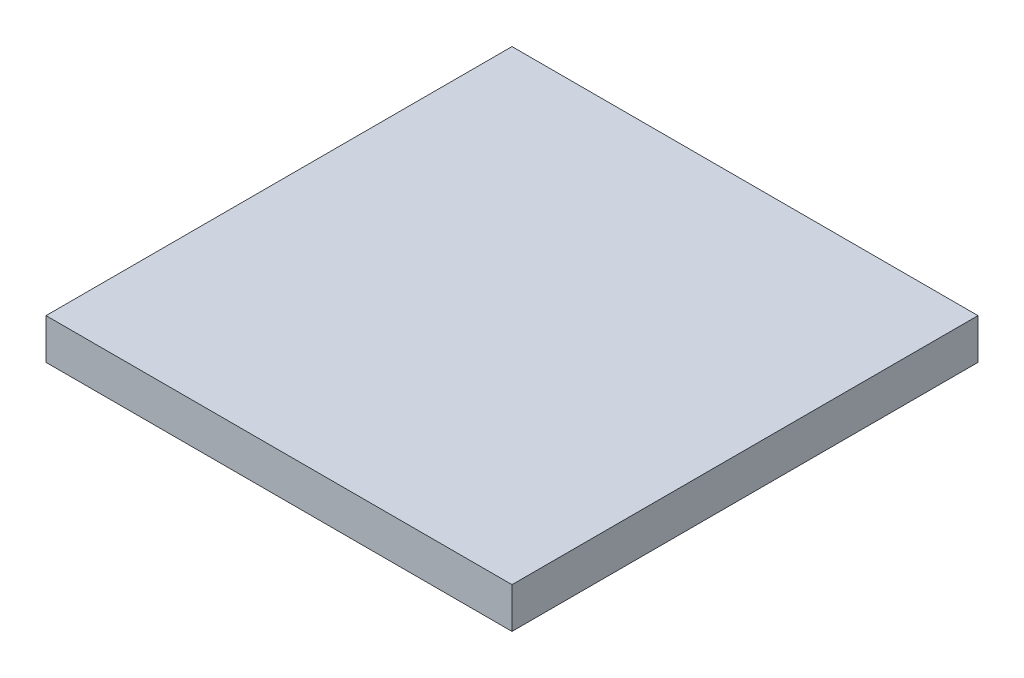
ISO-10303-21;
HEADER;
FILE_DESCRIPTION(('STEP AP214'),'2;1');
FILE_NAME('part.step','',(''),(''),'','','');
FILE_SCHEMA(('AUTOMOTIVE_DESIGN { 1 0 10303 214 1 1 1 1 }'));
ENDSEC;
DATA;
#1=APPLICATION_CONTEXT('core data for automotive mechanical design processes');
#2=APPLICATION_PROTOCOL_DEFINITION('international standard','automotive_design',2000,#1);
#3=PRODUCT_CONTEXT('',#1,'mechanical');
#4=PRODUCT('Part','Part','',(#3));
#5=PRODUCT_RELATED_PRODUCT_CATEGORY('part','',(#4));
#6=PRODUCT_DEFINITION_FORMATION('','',#4);
#7=PRODUCT_DEFINITION_CONTEXT('part definition',#1,'design');
#8=PRODUCT_DEFINITION('design','',#6,#7);
#9=PRODUCT_DEFINITION_SHAPE('','',#8);
#10=(LENGTH_UNIT() NAMED_UNIT(*) SI_UNIT(.MILLI.,.METRE.));
#11=(NAMED_UNIT(*) PLANE_ANGLE_UNIT() SI_UNIT($,.RADIAN.));
#12=(NAMED_UNIT(*) SI_UNIT($,.STERADIAN.) SOLID_ANGLE_UNIT());
#13=UNCERTAINTY_MEASURE_WITH_UNIT(LENGTH_MEASURE(1.E-05),#10,'distance_accuracy_value','');
#14=(GEOMETRIC_REPRESENTATION_CONTEXT(3) GLOBAL_UNCERTAINTY_ASSIGNED_CONTEXT((#13)) GLOBAL_UNIT_ASSIGNED_CONTEXT((#10,
#11,#12)) REPRESENTATION_CONTEXT('',''));
#15=CARTESIAN_POINT('',(0.,0.,0.));
#16=DIRECTION('',(0.,0.,1.));
#17=DIRECTION('',(1.,0.,0.));
#18=AXIS2_PLACEMENT_3D('',#15,#16,#17);
#19=CARTESIAN_POINT('',(57.5,10.,57.5));
#20=DIRECTION('',(-1.,0.,0.));
#21=DIRECTION('',(0.,0.,1.));
#22=AXIS2_PLACEMENT_3D('',#19,#20,#21);
#23=PLANE('',#22);
#24=DIRECTION('',(0.,0.,-1.));
#25=VECTOR('',#24,1.);
#26=CARTESIAN_POINT('',(57.5,0.,57.5));
#27=LINE('',#26,#25);
#28=CARTESIAN_POINT('',(57.5,0.,57.5));
#29=VERTEX_POINT('',#28);
#30=CARTESIAN_POINT('',(57.5,0.,-57.5));
#31=VERTEX_POINT('',#30);
#32=EDGE_CURVE('E107',#29,#31,#27,.T.);
#33=ORIENTED_EDGE('',*,*,#32,.T.);
#34=DIRECTION('',(0.,-1.,0.));
#35=VECTOR('',#34,1.);
#36=CARTESIAN_POINT('',(57.5,10.,-57.5));
#37=LINE('',#36,#35);
#38=CARTESIAN_POINT('',(57.5,10.,-57.5));
#39=VERTEX_POINT('',#38);
#40=EDGE_CURVE('E11',#39,#31,#37,.T.);
#41=ORIENTED_EDGE('',*,*,#40,.F.);
#42=DIRECTION('',(0.,0.,-1.));
#43=VECTOR('',#42,1.);
#44=CARTESIAN_POINT('',(57.5,10.,57.5));
#45=LINE('',#44,#43);
#46=CARTESIAN_POINT('',(57.5,10.,57.5));
#47=VERTEX_POINT('',#46);
#48=EDGE_CURVE('E91',#47,#39,#45,.T.);
#49=ORIENTED_EDGE('',*,*,#48,.F.);
#50=DIRECTION('',(0.,-1.,0.));
#51=VECTOR('',#50,1.);
#52=CARTESIAN_POINT('',(57.5,10.,57.5));
#53=LINE('',#52,#51);
#54=EDGE_CURVE('E103',#47,#29,#53,.T.);
#55=ORIENTED_EDGE('',*,*,#54,.T.);
#56=EDGE_LOOP('',(#33,#41,#49,#55));
#57=FACE_BOUND('',#56,.T.);
#58=ADVANCED_FACE('F39',(#57),#23,.F.);
#59=CARTESIAN_POINT('',(-57.5,10.,-57.5));
#60=DIRECTION('',(0.,0.,1.));
#61=DIRECTION('',(1.,0.,0.));
#62=AXIS2_PLACEMENT_3D('',#59,#60,#61);
#63=PLANE('',#62);
#64=DIRECTION('',(-1.,0.,0.));
#65=VECTOR('',#64,1.);
#66=CARTESIAN_POINT('',(-57.5,0.,-57.5));
#67=LINE('',#66,#65);
#68=CARTESIAN_POINT('',(-57.5,0.,-57.5));
#69=VERTEX_POINT('',#68);
#70=EDGE_CURVE('E96',#31,#69,#67,.T.);
#71=ORIENTED_EDGE('',*,*,#70,.T.);
#72=DIRECTION('',(0.,-1.,0.));
#73=VECTOR('',#72,1.);
#74=CARTESIAN_POINT('',(-57.5,10.,-57.5));
#75=LINE('',#74,#73);
#76=CARTESIAN_POINT('',(-57.5,10.,-57.5));
#77=VERTEX_POINT('',#76);
#78=EDGE_CURVE('E48',#77,#69,#75,.T.);
#79=ORIENTED_EDGE('',*,*,#78,.F.);
#80=DIRECTION('',(-1.,0.,0.));
#81=VECTOR('',#80,1.);
#82=CARTESIAN_POINT('',(-57.5,10.,-57.5));
#83=LINE('',#82,#81);
#84=EDGE_CURVE('E86',#39,#77,#83,.T.);
#85=ORIENTED_EDGE('',*,*,#84,.F.);
#86=ORIENTED_EDGE('',*,*,#40,.T.);
#87=EDGE_LOOP('',(#71,#79,#85,#86));
#88=FACE_BOUND('',#87,.T.);
#89=ADVANCED_FACE('F95',(#88),#63,.F.);
#90=CARTESIAN_POINT('',(-57.5,10.,57.5));
#91=DIRECTION('',(1.,0.,0.));
#92=DIRECTION('',(0.,0.,-1.));
#93=AXIS2_PLACEMENT_3D('',#90,#91,#92);
#94=PLANE('',#93);
#95=DIRECTION('',(0.,0.,1.));
#96=VECTOR('',#95,1.);
#97=CARTESIAN_POINT('',(-57.5,0.,57.5));
#98=LINE('',#97,#96);
#99=CARTESIAN_POINT('',(-57.5,0.,57.5));
#100=VERTEX_POINT('',#99);
#101=EDGE_CURVE('E73',#69,#100,#98,.T.);
#102=ORIENTED_EDGE('',*,*,#101,.T.);
#103=DIRECTION('',(0.,-1.,0.));
#104=VECTOR('',#103,1.);
#105=CARTESIAN_POINT('',(-57.5,10.,57.5));
#106=LINE('',#105,#104);
#107=CARTESIAN_POINT('',(-57.5,10.,57.5));
#108=VERTEX_POINT('',#107);
#109=EDGE_CURVE('E98',#108,#100,#106,.T.);
#110=ORIENTED_EDGE('',*,*,#109,.F.);
#111=DIRECTION('',(0.,0.,1.));
#112=VECTOR('',#111,1.);
#113=CARTESIAN_POINT('',(-57.5,10.,57.5));
#114=LINE('',#113,#112);
#115=EDGE_CURVE('E89',#77,#108,#114,.T.);
#116=ORIENTED_EDGE('',*,*,#115,.F.);
#117=ORIENTED_EDGE('',*,*,#78,.T.);
#118=EDGE_LOOP('',(#102,#110,#116,#117));
#119=FACE_BOUND('',#118,.T.);
#120=ADVANCED_FACE('F99',(#119),#94,.F.);
#121=CARTESIAN_POINT('',(-57.5,10.,57.5));
#122=DIRECTION('',(0.,0.,-1.));
#123=DIRECTION('',(-1.,0.,0.));
#124=AXIS2_PLACEMENT_3D('',#121,#122,#123);
#125=PLANE('',#124);
#126=DIRECTION('',(1.,0.,0.));
#127=VECTOR('',#126,1.);
#128=CARTESIAN_POINT('',(-57.5,0.,57.5));
#129=LINE('',#128,#127);
#130=EDGE_CURVE('E79',#100,#29,#129,.T.);
#131=ORIENTED_EDGE('',*,*,#130,.T.);
#132=ORIENTED_EDGE('',*,*,#54,.F.);
#133=DIRECTION('',(1.,0.,0.));
#134=VECTOR('',#133,1.);
#135=CARTESIAN_POINT('',(-57.5,10.,57.5));
#136=LINE('',#135,#134);
#137=EDGE_CURVE('E56',#108,#47,#136,.T.);
#138=ORIENTED_EDGE('',*,*,#137,.F.);
#139=ORIENTED_EDGE('',*,*,#109,.T.);
#140=EDGE_LOOP('',(#131,#132,#138,#139));
#141=FACE_BOUND('',#140,.T.);
#142=ADVANCED_FACE('F120',(#141),#125,.F.);
#143=CARTESIAN_POINT('',(0.,10.,0.));
#144=DIRECTION('',(0.,-1.,0.));
#145=DIRECTION('',(0.,0.,-1.));
#146=AXIS2_PLACEMENT_3D('',#143,#144,#145);
#147=PLANE('',#146);
#148=ORIENTED_EDGE('',*,*,#48,.T.);
#149=ORIENTED_EDGE('',*,*,#84,.T.);
#150=ORIENTED_EDGE('',*,*,#115,.T.);
#151=ORIENTED_EDGE('',*,*,#137,.T.);
#152=EDGE_LOOP('',(#148,#149,#150,#151));
#153=FACE_BOUND('',#152,.T.);
#154=ADVANCED_FACE('F87',(#153),#147,.F.);
#155=CARTESIAN_POINT('',(0.,0.,0.));
#156=DIRECTION('',(0.,-1.,0.));
#157=DIRECTION('',(0.,0.,-1.));
#158=AXIS2_PLACEMENT_3D('',#155,#156,#157);
#159=PLANE('',#158);
#160=ORIENTED_EDGE('',*,*,#32,.F.);
#161=ORIENTED_EDGE('',*,*,#130,.F.);
#162=ORIENTED_EDGE('',*,*,#101,.F.);
#163=ORIENTED_EDGE('',*,*,#70,.F.);
#164=EDGE_LOOP('',(#160,#161,#162,#163));
#165=FACE_BOUND('',#164,.T.);
#166=ADVANCED_FACE('F123',(#165),#159,.T.);
#167=CLOSED_SHELL('',(#58,#89,#120,#142,#154,#166));
#168=MANIFOLD_SOLID_BREP('B2',#167);
#169=ADVANCED_BREP_SHAPE_REPRESENTATION('',(#18,#168),#14);
#170=SHAPE_DEFINITION_REPRESENTATION(#9,#169);
ENDSEC;
END-ISO-10303-21;
